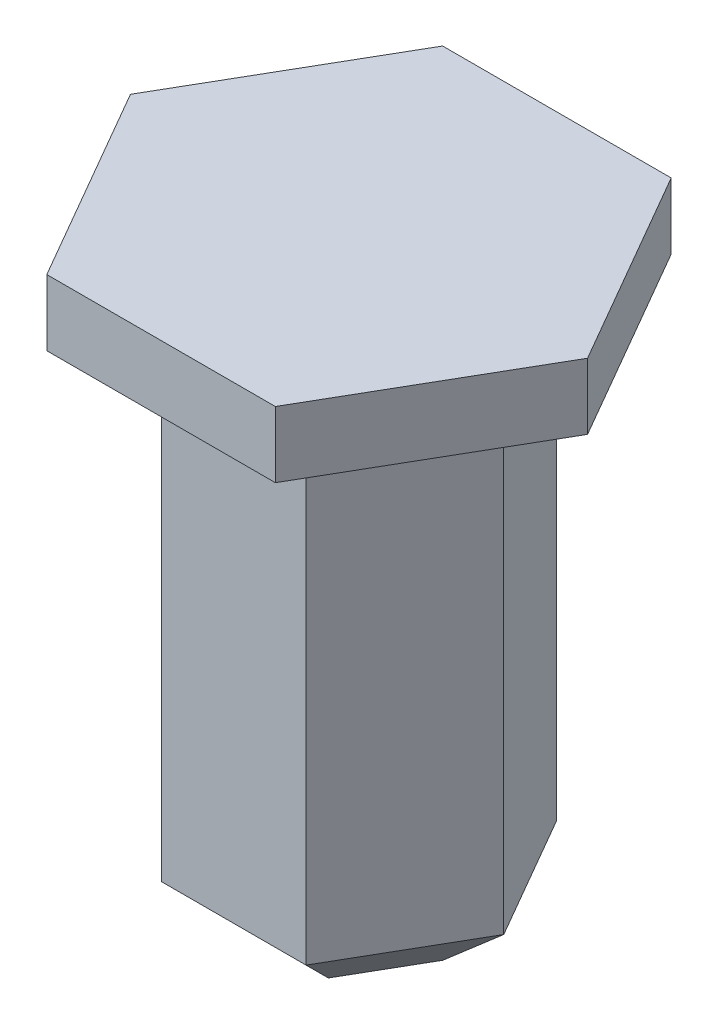
ISO-10303-21;
HEADER;
FILE_DESCRIPTION(('STEP AP214'),'2;1');
FILE_NAME('part.step','',(''),(''),'','','');
FILE_SCHEMA(('AUTOMOTIVE_DESIGN { 1 0 10303 214 1 1 1 1 }'));
ENDSEC;
DATA;
#1=APPLICATION_CONTEXT('core data for automotive mechanical design processes');
#2=APPLICATION_PROTOCOL_DEFINITION('international standard','automotive_design',2000,#1);
#3=PRODUCT_CONTEXT('',#1,'mechanical');
#4=PRODUCT('Part','Part','',(#3));
#5=PRODUCT_RELATED_PRODUCT_CATEGORY('part','',(#4));
#6=PRODUCT_DEFINITION_FORMATION('','',#4);
#7=PRODUCT_DEFINITION_CONTEXT('part definition',#1,'design');
#8=PRODUCT_DEFINITION('design','',#6,#7);
#9=PRODUCT_DEFINITION_SHAPE('','',#8);
#10=(LENGTH_UNIT() NAMED_UNIT(*) SI_UNIT(.MILLI.,.METRE.));
#11=(NAMED_UNIT(*) PLANE_ANGLE_UNIT() SI_UNIT($,.RADIAN.));
#12=(NAMED_UNIT(*) SI_UNIT($,.STERADIAN.) SOLID_ANGLE_UNIT());
#13=UNCERTAINTY_MEASURE_WITH_UNIT(LENGTH_MEASURE(1.E-05),#10,'distance_accuracy_value','');
#14=(GEOMETRIC_REPRESENTATION_CONTEXT(3) GLOBAL_UNCERTAINTY_ASSIGNED_CONTEXT((#13)) GLOBAL_UNIT_ASSIGNED_CONTEXT((#10,
#11,#12)) REPRESENTATION_CONTEXT('',''));
#15=CARTESIAN_POINT('',(0.,0.,0.));
#16=DIRECTION('',(0.,0.,1.));
#17=DIRECTION('',(1.,0.,0.));
#18=AXIS2_PLACEMENT_3D('',#15,#16,#17);
#19=CARTESIAN_POINT('',(1.09696551146029,8.,-1.9));
#20=DIRECTION('',(0.,0.,1.));
#21=DIRECTION('',(1.,0.,0.));
#22=AXIS2_PLACEMENT_3D('',#19,#20,#21);
#23=PLANE('',#22);
#24=DIRECTION('',(0.,-1.,0.));
#25=VECTOR('',#24,1.);
#26=CARTESIAN_POINT('',(1.09696551146029,8.,-1.9));
#27=LINE('',#26,#25);
#28=CARTESIAN_POINT('',(1.09696551146029,8.,-1.9));
#29=VERTEX_POINT('',#28);
#30=CARTESIAN_POINT('',(1.09696551146029,0.799999999999999,-1.9));
#31=VERTEX_POINT('',#30);
#32=EDGE_CURVE('E193',#29,#31,#27,.T.);
#33=ORIENTED_EDGE('',*,*,#32,.T.);
#34=DIRECTION('',(-1.,0.,0.));
#35=VECTOR('',#34,1.);
#36=CARTESIAN_POINT('',(1.09696551146029,0.799999999999999,-1.9));
#37=LINE('',#36,#35);
#38=CARTESIAN_POINT('',(-1.09696551146029,0.799999999999999,-1.9));
#39=VERTEX_POINT('',#38);
#40=EDGE_CURVE('E11',#31,#39,#37,.T.);
#41=ORIENTED_EDGE('',*,*,#40,.T.);
#42=DIRECTION('',(0.,-1.,0.));
#43=VECTOR('',#42,1.);
#44=CARTESIAN_POINT('',(-1.09696551146029,8.,-1.9));
#45=LINE('',#44,#43);
#46=CARTESIAN_POINT('',(-1.09696551146029,8.,-1.9));
#47=VERTEX_POINT('',#46);
#48=EDGE_CURVE('E205',#47,#39,#45,.T.);
#49=ORIENTED_EDGE('',*,*,#48,.F.);
#50=DIRECTION('',(-1.,0.,0.));
#51=VECTOR('',#50,1.);
#52=CARTESIAN_POINT('',(1.09696551146029,8.,-1.9));
#53=LINE('',#52,#51);
#54=EDGE_CURVE('E170',#29,#47,#53,.T.);
#55=ORIENTED_EDGE('',*,*,#54,.F.);
#56=EDGE_LOOP('',(#33,#41,#49,#55));
#57=FACE_BOUND('',#56,.T.);
#58=ADVANCED_FACE('F35',(#57),#23,.F.);
#59=CARTESIAN_POINT('',(-1.09696551146029,8.,-1.9));
#60=DIRECTION('',(0.866025403784439,0.,0.5));
#61=DIRECTION('',(0.5,0.,-0.866025403784439));
#62=AXIS2_PLACEMENT_3D('',#59,#60,#61);
#63=PLANE('',#62);
#64=ORIENTED_EDGE('',*,*,#48,.T.);
#65=DIRECTION('',(-0.5,0.,0.866025403784439));
#66=VECTOR('',#65,1.);
#67=CARTESIAN_POINT('',(-1.09696551146029,0.799999999999999,-1.9));
#68=LINE('',#67,#66);
#69=CARTESIAN_POINT('',(-2.19393102292058,0.799999999999999,0.));
#70=VERTEX_POINT('',#69);
#71=EDGE_CURVE('E208',#39,#70,#68,.T.);
#72=ORIENTED_EDGE('',*,*,#71,.T.);
#73=DIRECTION('',(0.,-1.,0.));
#74=VECTOR('',#73,1.);
#75=CARTESIAN_POINT('',(-2.19393102292058,8.,0.));
#76=LINE('',#75,#74);
#77=CARTESIAN_POINT('',(-2.19393102292058,8.,0.));
#78=VERTEX_POINT('',#77);
#79=EDGE_CURVE('E202',#78,#70,#76,.T.);
#80=ORIENTED_EDGE('',*,*,#79,.F.);
#81=DIRECTION('',(-0.5,0.,0.866025403784439));
#82=VECTOR('',#81,1.);
#83=CARTESIAN_POINT('',(-1.09696551146029,8.,-1.9));
#84=LINE('',#83,#82);
#85=EDGE_CURVE('E173',#47,#78,#84,.T.);
#86=ORIENTED_EDGE('',*,*,#85,.F.);
#87=EDGE_LOOP('',(#64,#72,#80,#86));
#88=FACE_BOUND('',#87,.T.);
#89=ADVANCED_FACE('F303',(#88),#63,.F.);
#90=CARTESIAN_POINT('',(-2.19393102292058,8.,0.));
#91=DIRECTION('',(0.866025403784439,0.,-0.5));
#92=DIRECTION('',(-0.5,0.,-0.866025403784439));
#93=AXIS2_PLACEMENT_3D('',#90,#91,#92);
#94=PLANE('',#93);
#95=ORIENTED_EDGE('',*,*,#79,.T.);
#96=DIRECTION('',(0.5,0.,0.866025403784439));
#97=VECTOR('',#96,1.);
#98=CARTESIAN_POINT('',(-2.19393102292058,0.799999999999999,0.));
#99=LINE('',#98,#97);
#100=CARTESIAN_POINT('',(-1.09696551146029,0.799999999999999,1.9));
#101=VERTEX_POINT('',#100);
#102=EDGE_CURVE('E224',#70,#101,#99,.T.);
#103=ORIENTED_EDGE('',*,*,#102,.T.);
#104=DIRECTION('',(0.,-1.,0.));
#105=VECTOR('',#104,1.);
#106=CARTESIAN_POINT('',(-1.09696551146029,8.,1.9));
#107=LINE('',#106,#105);
#108=CARTESIAN_POINT('',(-1.09696551146029,8.,1.9));
#109=VERTEX_POINT('',#108);
#110=EDGE_CURVE('E199',#109,#101,#107,.T.);
#111=ORIENTED_EDGE('',*,*,#110,.F.);
#112=DIRECTION('',(0.5,0.,0.866025403784439));
#113=VECTOR('',#112,1.);
#114=CARTESIAN_POINT('',(-2.19393102292058,8.,0.));
#115=LINE('',#114,#113);
#116=EDGE_CURVE('E181',#78,#109,#115,.T.);
#117=ORIENTED_EDGE('',*,*,#116,.F.);
#118=EDGE_LOOP('',(#95,#103,#111,#117));
#119=FACE_BOUND('',#118,.T.);
#120=ADVANCED_FACE('F309',(#119),#94,.F.);
#121=CARTESIAN_POINT('',(-1.09696551146029,8.,1.9));
#122=DIRECTION('',(0.,0.,-1.));
#123=DIRECTION('',(-1.,0.,0.));
#124=AXIS2_PLACEMENT_3D('',#121,#122,#123);
#125=PLANE('',#124);
#126=ORIENTED_EDGE('',*,*,#110,.T.);
#127=DIRECTION('',(1.,0.,0.));
#128=VECTOR('',#127,1.);
#129=CARTESIAN_POINT('',(-1.09696551146029,0.799999999999999,1.9));
#130=LINE('',#129,#128);
#131=CARTESIAN_POINT('',(1.09696551146029,0.799999999999999,1.9));
#132=VERTEX_POINT('',#131);
#133=EDGE_CURVE('E226',#101,#132,#130,.T.);
#134=ORIENTED_EDGE('',*,*,#133,.T.);
#135=DIRECTION('',(0.,-1.,0.));
#136=VECTOR('',#135,1.);
#137=CARTESIAN_POINT('',(1.09696551146029,8.,1.9));
#138=LINE('',#137,#136);
#139=CARTESIAN_POINT('',(1.09696551146029,8.,1.9));
#140=VERTEX_POINT('',#139);
#141=EDGE_CURVE('E197',#140,#132,#138,.T.);
#142=ORIENTED_EDGE('',*,*,#141,.F.);
#143=DIRECTION('',(1.,0.,0.));
#144=VECTOR('',#143,1.);
#145=CARTESIAN_POINT('',(-1.09696551146029,8.,1.9));
#146=LINE('',#145,#144);
#147=EDGE_CURVE('E184',#109,#140,#146,.T.);
#148=ORIENTED_EDGE('',*,*,#147,.F.);
#149=EDGE_LOOP('',(#126,#134,#142,#148));
#150=FACE_BOUND('',#149,.T.);
#151=ADVANCED_FACE('F372',(#150),#125,.F.);
#152=CARTESIAN_POINT('',(1.09696551146029,8.,1.9));
#153=DIRECTION('',(-0.866025403784439,0.,-0.5));
#154=DIRECTION('',(-0.5,0.,0.866025403784439));
#155=AXIS2_PLACEMENT_3D('',#152,#153,#154);
#156=PLANE('',#155);
#157=ORIENTED_EDGE('',*,*,#141,.T.);
#158=DIRECTION('',(0.5,0.,-0.866025403784439));
#159=VECTOR('',#158,1.);
#160=CARTESIAN_POINT('',(1.09696551146029,0.799999999999999,1.9));
#161=LINE('',#160,#159);
#162=CARTESIAN_POINT('',(2.19393102292058,0.799999999999999,0.));
#163=VERTEX_POINT('',#162);
#164=EDGE_CURVE('E60',#132,#163,#161,.T.);
#165=ORIENTED_EDGE('',*,*,#164,.T.);
#166=DIRECTION('',(0.,-1.,0.));
#167=VECTOR('',#166,1.);
#168=CARTESIAN_POINT('',(2.19393102292058,8.,0.));
#169=LINE('',#168,#167);
#170=CARTESIAN_POINT('',(2.19393102292058,8.,0.));
#171=VERTEX_POINT('',#170);
#172=EDGE_CURVE('E195',#171,#163,#169,.T.);
#173=ORIENTED_EDGE('',*,*,#172,.F.);
#174=DIRECTION('',(0.5,0.,-0.866025403784439));
#175=VECTOR('',#174,1.);
#176=CARTESIAN_POINT('',(1.09696551146029,8.,1.9));
#177=LINE('',#176,#175);
#178=EDGE_CURVE('E187',#140,#171,#177,.T.);
#179=ORIENTED_EDGE('',*,*,#178,.F.);
#180=EDGE_LOOP('',(#157,#165,#173,#179));
#181=FACE_BOUND('',#180,.T.);
#182=ADVANCED_FACE('F370',(#181),#156,.F.);
#183=CARTESIAN_POINT('',(2.19393102292058,8.,0.));
#184=DIRECTION('',(-0.866025403784439,0.,0.5));
#185=DIRECTION('',(0.5,0.,0.866025403784439));
#186=AXIS2_PLACEMENT_3D('',#183,#184,#185);
#187=PLANE('',#186);
#188=ORIENTED_EDGE('',*,*,#172,.T.);
#189=DIRECTION('',(-0.5,0.,-0.866025403784439));
#190=VECTOR('',#189,1.);
#191=CARTESIAN_POINT('',(2.19393102292058,0.799999999999999,0.));
#192=LINE('',#191,#190);
#193=EDGE_CURVE('E45',#163,#31,#192,.T.);
#194=ORIENTED_EDGE('',*,*,#193,.T.);
#195=ORIENTED_EDGE('',*,*,#32,.F.);
#196=DIRECTION('',(-0.5,0.,-0.866025403784439));
#197=VECTOR('',#196,1.);
#198=CARTESIAN_POINT('',(2.19393102292058,8.,0.));
#199=LINE('',#198,#197);
#200=EDGE_CURVE('E190',#171,#29,#199,.T.);
#201=ORIENTED_EDGE('',*,*,#200,.F.);
#202=EDGE_LOOP('',(#188,#194,#195,#201));
#203=FACE_BOUND('',#202,.T.);
#204=ADVANCED_FACE('F367',(#203),#187,.F.);
#205=CARTESIAN_POINT('',(0.,0.,0.));
#206=DIRECTION('',(0.,1.,0.));
#207=DIRECTION('',(0.,0.,1.));
#208=AXIS2_PLACEMENT_3D('',#205,#206,#207);
#209=PLANE('',#208);
#210=DIRECTION('',(-0.5,0.,-0.866025403784439));
#211=VECTOR('',#210,1.);
#212=CARTESIAN_POINT('',(-0.95262794416288,0.,0.549999999999998));
#213=LINE('',#212,#211);
#214=CARTESIAN_POINT('',(-0.635085296108587,0.,1.1));
#215=VERTEX_POINT('',#214);
#216=CARTESIAN_POINT('',(-1.27017059221717,0.,0.));
#217=VERTEX_POINT('',#216);
#218=EDGE_CURVE('E219',#215,#217,#213,.T.);
#219=ORIENTED_EDGE('',*,*,#218,.T.);
#220=DIRECTION('',(0.5,0.,-0.866025403784439));
#221=VECTOR('',#220,1.);
#222=CARTESIAN_POINT('',(-0.952627944162881,0.,-0.549999999999999));
#223=LINE('',#222,#221);
#224=CARTESIAN_POINT('',(-0.635085296108587,0.,-1.1));
#225=VERTEX_POINT('',#224);
#226=EDGE_CURVE('E221',#217,#225,#223,.T.);
#227=ORIENTED_EDGE('',*,*,#226,.T.);
#228=DIRECTION('',(1.,0.,0.));
#229=VECTOR('',#228,1.);
#230=CARTESIAN_POINT('',(0.,0.,-1.1));
#231=LINE('',#230,#229);
#232=CARTESIAN_POINT('',(0.635085296108586,0.,-1.1));
#233=VERTEX_POINT('',#232);
#234=EDGE_CURVE('E211',#225,#233,#231,.T.);
#235=ORIENTED_EDGE('',*,*,#234,.T.);
#236=DIRECTION('',(0.5,0.,0.866025403784439));
#237=VECTOR('',#236,1.);
#238=CARTESIAN_POINT('',(0.95262794416288,0.,-0.549999999999999));
#239=LINE('',#238,#237);
#240=CARTESIAN_POINT('',(1.27017059221717,0.,0.));
#241=VERTEX_POINT('',#240);
#242=EDGE_CURVE('E213',#233,#241,#239,.T.);
#243=ORIENTED_EDGE('',*,*,#242,.T.);
#244=DIRECTION('',(-0.5,0.,0.866025403784439));
#245=VECTOR('',#244,1.);
#246=CARTESIAN_POINT('',(0.952627944162881,0.,0.549999999999999));
#247=LINE('',#246,#245);
#248=CARTESIAN_POINT('',(0.635085296108587,0.,1.1));
#249=VERTEX_POINT('',#248);
#250=EDGE_CURVE('E215',#241,#249,#247,.T.);
#251=ORIENTED_EDGE('',*,*,#250,.T.);
#252=DIRECTION('',(-1.,0.,0.));
#253=VECTOR('',#252,1.);
#254=CARTESIAN_POINT('',(0.,0.,1.1));
#255=LINE('',#254,#253);
#256=EDGE_CURVE('E217',#249,#215,#255,.T.);
#257=ORIENTED_EDGE('',*,*,#256,.T.);
#258=EDGE_LOOP('',(#219,#227,#235,#243,#251,#257));
#259=FACE_BOUND('',#258,.T.);
#260=ADVANCED_FACE('F357',(#259),#209,.F.);
#261=CARTESIAN_POINT('',(0.,8.,0.));
#262=DIRECTION('',(0.,1.,0.));
#263=DIRECTION('',(0.,0.,1.));
#264=AXIS2_PLACEMENT_3D('',#261,#262,#263);
#265=PLANE('',#264);
#266=DIRECTION('',(0.5,0.,-0.866025403784439));
#267=VECTOR('',#266,1.);
#268=CARTESIAN_POINT('',(1.73205080756888,8.,3.));
#269=LINE('',#268,#267);
#270=CARTESIAN_POINT('',(1.73205080756888,8.,3.));
#271=VERTEX_POINT('',#270);
#272=CARTESIAN_POINT('',(3.46410161513775,8.,0.));
#273=VERTEX_POINT('',#272);
#274=EDGE_CURVE('E169',#271,#273,#269,.T.);
#275=ORIENTED_EDGE('',*,*,#274,.F.);
#276=DIRECTION('',(1.,0.,0.));
#277=VECTOR('',#276,1.);
#278=CARTESIAN_POINT('',(-1.73205080756888,8.,3.));
#279=LINE('',#278,#277);
#280=CARTESIAN_POINT('',(-1.73205080756888,8.,3.));
#281=VERTEX_POINT('',#280);
#282=EDGE_CURVE('E165',#281,#271,#279,.T.);
#283=ORIENTED_EDGE('',*,*,#282,.F.);
#284=DIRECTION('',(0.5,0.,0.866025403784439));
#285=VECTOR('',#284,1.);
#286=CARTESIAN_POINT('',(-3.46410161513775,8.,0.));
#287=LINE('',#286,#285);
#288=CARTESIAN_POINT('',(-3.46410161513775,8.,0.));
#289=VERTEX_POINT('',#288);
#290=EDGE_CURVE('E259',#289,#281,#287,.T.);
#291=ORIENTED_EDGE('',*,*,#290,.F.);
#292=DIRECTION('',(-0.5,0.,0.866025403784439));
#293=VECTOR('',#292,1.);
#294=CARTESIAN_POINT('',(-1.73205080756888,8.,-3.));
#295=LINE('',#294,#293);
#296=CARTESIAN_POINT('',(-1.73205080756888,8.,-3.));
#297=VERTEX_POINT('',#296);
#298=EDGE_CURVE('E257',#297,#289,#295,.T.);
#299=ORIENTED_EDGE('',*,*,#298,.F.);
#300=DIRECTION('',(-1.,0.,0.));
#301=VECTOR('',#300,1.);
#302=CARTESIAN_POINT('',(1.73205080756888,8.,-3.));
#303=LINE('',#302,#301);
#304=CARTESIAN_POINT('',(1.73205080756888,8.,-3.));
#305=VERTEX_POINT('',#304);
#306=EDGE_CURVE('E251',#305,#297,#303,.T.);
#307=ORIENTED_EDGE('',*,*,#306,.F.);
#308=DIRECTION('',(-0.5,0.,-0.866025403784439));
#309=VECTOR('',#308,1.);
#310=CARTESIAN_POINT('',(3.46410161513775,8.,0.));
#311=LINE('',#310,#309);
#312=EDGE_CURVE('E249',#273,#305,#311,.T.);
#313=ORIENTED_EDGE('',*,*,#312,.F.);
#314=EDGE_LOOP('',(#275,#283,#291,#299,#307,#313));
#315=FACE_BOUND('',#314,.T.);
#316=ORIENTED_EDGE('',*,*,#200,.T.);
#317=ORIENTED_EDGE('',*,*,#54,.T.);
#318=ORIENTED_EDGE('',*,*,#85,.T.);
#319=ORIENTED_EDGE('',*,*,#116,.T.);
#320=ORIENTED_EDGE('',*,*,#147,.T.);
#321=ORIENTED_EDGE('',*,*,#178,.T.);
#322=EDGE_LOOP('',(#316,#317,#318,#319,#320,#321));
#323=FACE_BOUND('',#322,.T.);
#324=ADVANCED_FACE('F281',(#315,#323),#265,.F.);
#325=CARTESIAN_POINT('',(1.73205080756888,9.,3.));
#326=DIRECTION('',(-0.866025403784439,0.,-0.5));
#327=DIRECTION('',(-0.5,0.,0.866025403784439));
#328=AXIS2_PLACEMENT_3D('',#325,#326,#327);
#329=PLANE('',#328);
#330=ORIENTED_EDGE('',*,*,#274,.T.);
#331=DIRECTION('',(0.,-1.,0.));
#332=VECTOR('',#331,1.);
#333=CARTESIAN_POINT('',(3.46410161513775,9.,0.));
#334=LINE('',#333,#332);
#335=CARTESIAN_POINT('',(3.46410161513775,9.,0.));
#336=VERTEX_POINT('',#335);
#337=EDGE_CURVE('E149',#336,#273,#334,.T.);
#338=ORIENTED_EDGE('',*,*,#337,.F.);
#339=DIRECTION('',(0.5,0.,-0.866025403784439));
#340=VECTOR('',#339,1.);
#341=CARTESIAN_POINT('',(1.73205080756888,9.,3.));
#342=LINE('',#341,#340);
#343=CARTESIAN_POINT('',(1.73205080756888,9.,3.));
#344=VERTEX_POINT('',#343);
#345=EDGE_CURVE('E156',#344,#336,#342,.T.);
#346=ORIENTED_EDGE('',*,*,#345,.F.);
#347=DIRECTION('',(0.,-1.,0.));
#348=VECTOR('',#347,1.);
#349=CARTESIAN_POINT('',(1.73205080756888,9.,3.));
#350=LINE('',#349,#348);
#351=EDGE_CURVE('E262',#344,#271,#350,.T.);
#352=ORIENTED_EDGE('',*,*,#351,.T.);
#353=EDGE_LOOP('',(#330,#338,#346,#352));
#354=FACE_BOUND('',#353,.T.);
#355=ADVANCED_FACE('F167',(#354),#329,.F.);
#356=CARTESIAN_POINT('',(3.46410161513775,9.,0.));
#357=DIRECTION('',(-0.866025403784439,0.,0.5));
#358=DIRECTION('',(0.5,0.,0.866025403784439));
#359=AXIS2_PLACEMENT_3D('',#356,#357,#358);
#360=PLANE('',#359);
#361=ORIENTED_EDGE('',*,*,#312,.T.);
#362=DIRECTION('',(0.,-1.,0.));
#363=VECTOR('',#362,1.);
#364=CARTESIAN_POINT('',(1.73205080756888,9.,-3.));
#365=LINE('',#364,#363);
#366=CARTESIAN_POINT('',(1.73205080756888,9.,-3.));
#367=VERTEX_POINT('',#366);
#368=EDGE_CURVE('E152',#367,#305,#365,.T.);
#369=ORIENTED_EDGE('',*,*,#368,.F.);
#370=DIRECTION('',(-0.5,0.,-0.866025403784439));
#371=VECTOR('',#370,1.);
#372=CARTESIAN_POINT('',(3.46410161513775,9.,0.));
#373=LINE('',#372,#371);
#374=EDGE_CURVE('E145',#336,#367,#373,.T.);
#375=ORIENTED_EDGE('',*,*,#374,.F.);
#376=ORIENTED_EDGE('',*,*,#337,.T.);
#377=EDGE_LOOP('',(#361,#369,#375,#376));
#378=FACE_BOUND('',#377,.T.);
#379=ADVANCED_FACE('F147',(#378),#360,.F.);
#380=CARTESIAN_POINT('',(1.73205080756888,9.,-3.));
#381=DIRECTION('',(0.,0.,1.));
#382=DIRECTION('',(1.,0.,0.));
#383=AXIS2_PLACEMENT_3D('',#380,#381,#382);
#384=PLANE('',#383);
#385=ORIENTED_EDGE('',*,*,#306,.T.);
#386=DIRECTION('',(0.,-1.,0.));
#387=VECTOR('',#386,1.);
#388=CARTESIAN_POINT('',(-1.73205080756888,9.,-3.));
#389=LINE('',#388,#387);
#390=CARTESIAN_POINT('',(-1.73205080756888,9.,-3.));
#391=VERTEX_POINT('',#390);
#392=EDGE_CURVE('E175',#391,#297,#389,.T.);
#393=ORIENTED_EDGE('',*,*,#392,.F.);
#394=DIRECTION('',(-1.,0.,0.));
#395=VECTOR('',#394,1.);
#396=CARTESIAN_POINT('',(1.73205080756888,9.,-3.));
#397=LINE('',#396,#395);
#398=EDGE_CURVE('E155',#367,#391,#397,.T.);
#399=ORIENTED_EDGE('',*,*,#398,.F.);
#400=ORIENTED_EDGE('',*,*,#368,.T.);
#401=EDGE_LOOP('',(#385,#393,#399,#400));
#402=FACE_BOUND('',#401,.T.);
#403=ADVANCED_FACE('F293',(#402),#384,.F.);
#404=CARTESIAN_POINT('',(-1.73205080756888,9.,-3.));
#405=DIRECTION('',(0.866025403784439,0.,0.5));
#406=DIRECTION('',(0.5,0.,-0.866025403784439));
#407=AXIS2_PLACEMENT_3D('',#404,#405,#406);
#408=PLANE('',#407);
#409=ORIENTED_EDGE('',*,*,#298,.T.);
#410=DIRECTION('',(0.,-1.,0.));
#411=VECTOR('',#410,1.);
#412=CARTESIAN_POINT('',(-3.46410161513775,9.,0.));
#413=LINE('',#412,#411);
#414=CARTESIAN_POINT('',(-3.46410161513775,9.,0.));
#415=VERTEX_POINT('',#414);
#416=EDGE_CURVE('E267',#415,#289,#413,.T.);
#417=ORIENTED_EDGE('',*,*,#416,.F.);
#418=DIRECTION('',(-0.5,0.,0.866025403784439));
#419=VECTOR('',#418,1.);
#420=CARTESIAN_POINT('',(-1.73205080756888,9.,-3.));
#421=LINE('',#420,#419);
#422=EDGE_CURVE('E276',#391,#415,#421,.T.);
#423=ORIENTED_EDGE('',*,*,#422,.F.);
#424=ORIENTED_EDGE('',*,*,#392,.T.);
#425=EDGE_LOOP('',(#409,#417,#423,#424));
#426=FACE_BOUND('',#425,.T.);
#427=ADVANCED_FACE('F274',(#426),#408,.F.);
#428=CARTESIAN_POINT('',(-3.46410161513775,9.,0.));
#429=DIRECTION('',(0.866025403784439,0.,-0.5));
#430=DIRECTION('',(-0.5,0.,-0.866025403784439));
#431=AXIS2_PLACEMENT_3D('',#428,#429,#430);
#432=PLANE('',#431);
#433=ORIENTED_EDGE('',*,*,#290,.T.);
#434=DIRECTION('',(0.,-1.,0.));
#435=VECTOR('',#434,1.);
#436=CARTESIAN_POINT('',(-1.73205080756888,9.,3.));
#437=LINE('',#436,#435);
#438=CARTESIAN_POINT('',(-1.73205080756888,9.,3.));
#439=VERTEX_POINT('',#438);
#440=EDGE_CURVE('E264',#439,#281,#437,.T.);
#441=ORIENTED_EDGE('',*,*,#440,.F.);
#442=DIRECTION('',(0.5,0.,0.866025403784439));
#443=VECTOR('',#442,1.);
#444=CARTESIAN_POINT('',(-3.46410161513775,9.,0.));
#445=LINE('',#444,#443);
#446=EDGE_CURVE('E290',#415,#439,#445,.T.);
#447=ORIENTED_EDGE('',*,*,#446,.F.);
#448=ORIENTED_EDGE('',*,*,#416,.T.);
#449=EDGE_LOOP('',(#433,#441,#447,#448));
#450=FACE_BOUND('',#449,.T.);
#451=ADVANCED_FACE('F286',(#450),#432,.F.);
#452=CARTESIAN_POINT('',(-1.73205080756888,9.,3.));
#453=DIRECTION('',(0.,0.,-1.));
#454=DIRECTION('',(-1.,0.,0.));
#455=AXIS2_PLACEMENT_3D('',#452,#453,#454);
#456=PLANE('',#455);
#457=ORIENTED_EDGE('',*,*,#282,.T.);
#458=ORIENTED_EDGE('',*,*,#351,.F.);
#459=DIRECTION('',(1.,0.,0.));
#460=VECTOR('',#459,1.);
#461=CARTESIAN_POINT('',(-1.73205080756888,9.,3.));
#462=LINE('',#461,#460);
#463=EDGE_CURVE('E161',#439,#344,#462,.T.);
#464=ORIENTED_EDGE('',*,*,#463,.F.);
#465=ORIENTED_EDGE('',*,*,#440,.T.);
#466=EDGE_LOOP('',(#457,#458,#464,#465));
#467=FACE_BOUND('',#466,.T.);
#468=ADVANCED_FACE('F289',(#467),#456,.F.);
#469=CARTESIAN_POINT('',(0.,9.,0.));
#470=DIRECTION('',(0.,1.,0.));
#471=DIRECTION('',(0.,0.,1.));
#472=AXIS2_PLACEMENT_3D('',#469,#470,#471);
#473=PLANE('',#472);
#474=ORIENTED_EDGE('',*,*,#345,.T.);
#475=ORIENTED_EDGE('',*,*,#374,.T.);
#476=ORIENTED_EDGE('',*,*,#398,.T.);
#477=ORIENTED_EDGE('',*,*,#422,.T.);
#478=ORIENTED_EDGE('',*,*,#446,.T.);
#479=ORIENTED_EDGE('',*,*,#463,.T.);
#480=EDGE_LOOP('',(#474,#475,#476,#477,#478,#479));
#481=FACE_BOUND('',#480,.T.);
#482=ADVANCED_FACE('F159',(#481),#473,.T.);
#483=CARTESIAN_POINT('',(1.09696551146029,0.799999999999999,1.9));
#484=DIRECTION('',(-0.612372435695793,0.707106781186549,-0.353553390593273));
#485=DIRECTION('',(0.5,0.,-0.866025403784439));
#486=AXIS2_PLACEMENT_3D('',#483,#484,#485);
#487=PLANE('',#486);
#488=DIRECTION('',(-0.377964473009228,-0.654653670707976,-0.654653670707978));
#489=VECTOR('',#488,1.);
#490=CARTESIAN_POINT('',(1.09696551146029,0.799999999999999,1.9));
#491=LINE('',#490,#489);
#492=EDGE_CURVE('E239',#249,#132,#491,.F.);
#493=ORIENTED_EDGE('',*,*,#492,.F.);
#494=ORIENTED_EDGE('',*,*,#250,.F.);
#495=DIRECTION('',(-0.755928946018456,-0.654653670707975,0.));
#496=VECTOR('',#495,1.);
#497=CARTESIAN_POINT('',(2.19393102292058,0.799999999999999,0.));
#498=LINE('',#497,#496);
#499=EDGE_CURVE('E40',#163,#241,#498,.T.);
#500=ORIENTED_EDGE('',*,*,#499,.F.);
#501=ORIENTED_EDGE('',*,*,#164,.F.);
#502=EDGE_LOOP('',(#493,#494,#500,#501));
#503=FACE_BOUND('',#502,.T.);
#504=ADVANCED_FACE('F38',(#503),#487,.F.);
#505=CARTESIAN_POINT('',(2.19393102292058,0.799999999999999,0.));
#506=DIRECTION('',(-0.612372435695793,0.707106781186549,0.353553390593273));
#507=DIRECTION('',(-0.5,0.,-0.866025403784439));
#508=AXIS2_PLACEMENT_3D('',#505,#506,#507);
#509=PLANE('',#508);
#510=ORIENTED_EDGE('',*,*,#499,.T.);
#511=ORIENTED_EDGE('',*,*,#242,.F.);
#512=DIRECTION('',(-0.377964473009228,-0.654653670707975,0.654653670707978));
#513=VECTOR('',#512,1.);
#514=CARTESIAN_POINT('',(1.09696551146029,0.799999999999999,-1.9));
#515=LINE('',#514,#513);
#516=EDGE_CURVE('E237',#31,#233,#515,.T.);
#517=ORIENTED_EDGE('',*,*,#516,.F.);
#518=ORIENTED_EDGE('',*,*,#193,.F.);
#519=EDGE_LOOP('',(#510,#511,#517,#518));
#520=FACE_BOUND('',#519,.T.);
#521=ADVANCED_FACE('F341',(#520),#509,.F.);
#522=CARTESIAN_POINT('',(-1.09696551146029,0.799999999999999,1.9));
#523=DIRECTION('',(0.,0.707106781186549,-0.707106781186546));
#524=DIRECTION('',(1.,0.,0.));
#525=AXIS2_PLACEMENT_3D('',#522,#523,#524);
#526=PLANE('',#525);
#527=ORIENTED_EDGE('',*,*,#492,.T.);
#528=ORIENTED_EDGE('',*,*,#133,.F.);
#529=DIRECTION('',(0.377964473009228,-0.654653670707976,-0.654653670707978));
#530=VECTOR('',#529,1.);
#531=CARTESIAN_POINT('',(-1.09696551146029,0.799999999999999,1.9));
#532=LINE('',#531,#530);
#533=EDGE_CURVE('E234',#215,#101,#532,.F.);
#534=ORIENTED_EDGE('',*,*,#533,.F.);
#535=ORIENTED_EDGE('',*,*,#256,.F.);
#536=EDGE_LOOP('',(#527,#528,#534,#535));
#537=FACE_BOUND('',#536,.T.);
#538=ADVANCED_FACE('F335',(#537),#526,.F.);
#539=CARTESIAN_POINT('',(1.09696551146029,0.799999999999999,-1.9));
#540=DIRECTION('',(0.,0.707106781186549,0.707106781186546));
#541=DIRECTION('',(-1.,0.,0.));
#542=AXIS2_PLACEMENT_3D('',#539,#540,#541);
#543=PLANE('',#542);
#544=ORIENTED_EDGE('',*,*,#516,.T.);
#545=ORIENTED_EDGE('',*,*,#234,.F.);
#546=DIRECTION('',(-0.377964473009228,0.654653670707975,-0.654653670707978));
#547=VECTOR('',#546,1.);
#548=CARTESIAN_POINT('',(-0.783546793900205,0.257142857142856,-1.35714285714286));
#549=LINE('',#548,#547);
#550=EDGE_CURVE('E232',#39,#225,#549,.F.);
#551=ORIENTED_EDGE('',*,*,#550,.F.);
#552=ORIENTED_EDGE('',*,*,#40,.F.);
#553=EDGE_LOOP('',(#544,#545,#551,#552));
#554=FACE_BOUND('',#553,.T.);
#555=ADVANCED_FACE('F328',(#554),#543,.F.);
#556=CARTESIAN_POINT('',(-2.19393102292058,0.799999999999999,0.));
#557=DIRECTION('',(0.612372435695793,0.707106781186549,-0.353553390593273));
#558=DIRECTION('',(0.5,0.,0.866025403784439));
#559=AXIS2_PLACEMENT_3D('',#556,#557,#558);
#560=PLANE('',#559);
#561=ORIENTED_EDGE('',*,*,#533,.T.);
#562=ORIENTED_EDGE('',*,*,#102,.F.);
#563=DIRECTION('',(0.755928946018456,-0.654653670707975,0.));
#564=VECTOR('',#563,1.);
#565=CARTESIAN_POINT('',(-2.19393102292058,0.799999999999999,0.));
#566=LINE('',#565,#564);
#567=EDGE_CURVE('E230',#217,#70,#566,.F.);
#568=ORIENTED_EDGE('',*,*,#567,.F.);
#569=ORIENTED_EDGE('',*,*,#218,.F.);
#570=EDGE_LOOP('',(#561,#562,#568,#569));
#571=FACE_BOUND('',#570,.T.);
#572=ADVANCED_FACE('F321',(#571),#560,.F.);
#573=CARTESIAN_POINT('',(-1.09696551146029,0.799999999999999,-1.9));
#574=DIRECTION('',(0.612372435695793,0.707106781186549,0.353553390593273));
#575=DIRECTION('',(-0.5,0.,0.866025403784439));
#576=AXIS2_PLACEMENT_3D('',#573,#574,#575);
#577=PLANE('',#576);
#578=ORIENTED_EDGE('',*,*,#550,.T.);
#579=ORIENTED_EDGE('',*,*,#226,.F.);
#580=ORIENTED_EDGE('',*,*,#567,.T.);
#581=ORIENTED_EDGE('',*,*,#71,.F.);
#582=EDGE_LOOP('',(#578,#579,#580,#581));
#583=FACE_BOUND('',#582,.T.);
#584=ADVANCED_FACE('F315',(#583),#577,.F.);
#585=CLOSED_SHELL('',(#58,#89,#120,#151,#182,#204,#260,#324,#355,#379,#403,#427,#451,#468,#482,
#504,#521,#538,#555,#572,#584));
#586=MANIFOLD_SOLID_BREP('B2',#585);
#587=ADVANCED_BREP_SHAPE_REPRESENTATION('',(#18,#586),#14);
#588=SHAPE_DEFINITION_REPRESENTATION(#9,#587);
ENDSEC;
END-ISO-10303-21;
